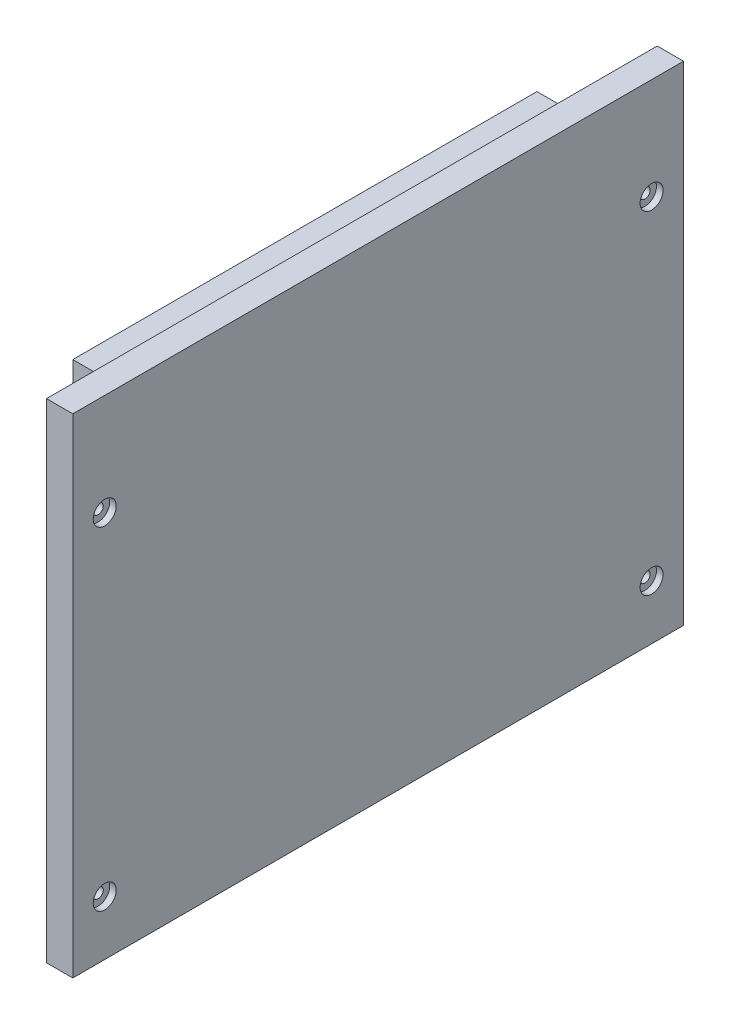
ISO-10303-21;
HEADER;
FILE_DESCRIPTION(('STEP AP214'),'2;1');
FILE_NAME('part.step','',(''),(''),'','','');
FILE_SCHEMA(('AUTOMOTIVE_DESIGN { 1 0 10303 214 1 1 1 1 }'));
ENDSEC;
DATA;
#1=APPLICATION_CONTEXT('core data for automotive mechanical design processes');
#2=APPLICATION_PROTOCOL_DEFINITION('international standard','automotive_design',2000,#1);
#3=PRODUCT_CONTEXT('',#1,'mechanical');
#4=PRODUCT('Part','Part','',(#3));
#5=PRODUCT_RELATED_PRODUCT_CATEGORY('part','',(#4));
#6=PRODUCT_DEFINITION_FORMATION('','',#4);
#7=PRODUCT_DEFINITION_CONTEXT('part definition',#1,'design');
#8=PRODUCT_DEFINITION('design','',#6,#7);
#9=PRODUCT_DEFINITION_SHAPE('','',#8);
#10=(LENGTH_UNIT() NAMED_UNIT(*) SI_UNIT(.MILLI.,.METRE.));
#11=(NAMED_UNIT(*) PLANE_ANGLE_UNIT() SI_UNIT($,.RADIAN.));
#12=(NAMED_UNIT(*) SI_UNIT($,.STERADIAN.) SOLID_ANGLE_UNIT());
#13=UNCERTAINTY_MEASURE_WITH_UNIT(LENGTH_MEASURE(1.E-05),#10,'distance_accuracy_value','');
#14=(GEOMETRIC_REPRESENTATION_CONTEXT(3) GLOBAL_UNCERTAINTY_ASSIGNED_CONTEXT((#13)) GLOBAL_UNIT_ASSIGNED_CONTEXT((#10,
#11,#12)) REPRESENTATION_CONTEXT('',''));
#15=CARTESIAN_POINT('',(0.,0.,0.));
#16=DIRECTION('',(0.,0.,1.));
#17=DIRECTION('',(1.,0.,0.));
#18=AXIS2_PLACEMENT_3D('',#15,#16,#17);
#19=CARTESIAN_POINT('',(39.,130.,175.));
#20=DIRECTION('',(0.,0.,-1.));
#21=DIRECTION('',(-1.,0.,0.));
#22=AXIS2_PLACEMENT_3D('',#19,#20,#21);
#23=PLANE('',#22);
#24=DIRECTION('',(0.,-1.,0.));
#25=VECTOR('',#24,1.);
#26=CARTESIAN_POINT('',(25.,130.,175.));
#27=LINE('',#26,#25);
#28=CARTESIAN_POINT('',(25.,130.,175.));
#29=VERTEX_POINT('',#28);
#30=CARTESIAN_POINT('',(25.,-130.,175.));
#31=VERTEX_POINT('',#30);
#32=EDGE_CURVE('E140',#29,#31,#27,.T.);
#33=ORIENTED_EDGE('',*,*,#32,.T.);
#34=DIRECTION('',(-1.,0.,0.));
#35=VECTOR('',#34,1.);
#36=CARTESIAN_POINT('',(39.,-130.,175.));
#37=LINE('',#36,#35);
#38=CARTESIAN_POINT('',(39.,-130.,175.));
#39=VERTEX_POINT('',#38);
#40=EDGE_CURVE('E40',#39,#31,#37,.T.);
#41=ORIENTED_EDGE('',*,*,#40,.F.);
#42=DIRECTION('',(0.,-1.,0.));
#43=VECTOR('',#42,1.);
#44=CARTESIAN_POINT('',(39.,130.,175.));
#45=LINE('',#44,#43);
#46=CARTESIAN_POINT('',(39.,130.,175.));
#47=VERTEX_POINT('',#46);
#48=EDGE_CURVE('E188',#47,#39,#45,.T.);
#49=ORIENTED_EDGE('',*,*,#48,.F.);
#50=DIRECTION('',(-1.,0.,0.));
#51=VECTOR('',#50,1.);
#52=CARTESIAN_POINT('',(39.,130.,175.));
#53=LINE('',#52,#51);
#54=EDGE_CURVE('E195',#47,#29,#53,.T.);
#55=ORIENTED_EDGE('',*,*,#54,.T.);
#56=EDGE_LOOP('',(#33,#41,#49,#55));
#57=FACE_BOUND('',#56,.T.);
#58=ADVANCED_FACE('F33',(#57),#23,.F.);
#59=CARTESIAN_POINT('',(39.,-130.,175.));
#60=DIRECTION('',(0.,1.,0.));
#61=DIRECTION('',(0.,0.,1.));
#62=AXIS2_PLACEMENT_3D('',#59,#60,#61);
#63=PLANE('',#62);
#64=ORIENTED_EDGE('',*,*,#40,.T.);
#65=DIRECTION('',(0.,0.,-1.));
#66=VECTOR('',#65,1.);
#67=CARTESIAN_POINT('',(25.,-130.,-150.));
#68=LINE('',#67,#66);
#69=CARTESIAN_POINT('',(25.,-130.,-150.));
#70=VERTEX_POINT('',#69);
#71=EDGE_CURVE('E128',#31,#70,#68,.T.);
#72=ORIENTED_EDGE('',*,*,#71,.T.);
#73=DIRECTION('',(-1.,0.,0.));
#74=VECTOR('',#73,1.);
#75=CARTESIAN_POINT('',(39.,-130.,-150.));
#76=LINE('',#75,#74);
#77=CARTESIAN_POINT('',(39.,-130.,-150.));
#78=VERTEX_POINT('',#77);
#79=EDGE_CURVE('E201',#78,#70,#76,.T.);
#80=ORIENTED_EDGE('',*,*,#79,.F.);
#81=DIRECTION('',(0.,0.,-1.));
#82=VECTOR('',#81,1.);
#83=CARTESIAN_POINT('',(39.,-130.,175.));
#84=LINE('',#83,#82);
#85=EDGE_CURVE('E190',#39,#78,#84,.T.);
#86=ORIENTED_EDGE('',*,*,#85,.F.);
#87=EDGE_LOOP('',(#64,#72,#80,#86));
#88=FACE_BOUND('',#87,.T.);
#89=ADVANCED_FACE('F231',(#88),#63,.F.);
#90=CARTESIAN_POINT('',(39.,130.,-150.));
#91=DIRECTION('',(0.,0.,1.));
#92=DIRECTION('',(1.,0.,0.));
#93=AXIS2_PLACEMENT_3D('',#90,#91,#92);
#94=PLANE('',#93);
#95=DIRECTION('',(0.,1.,0.));
#96=VECTOR('',#95,1.);
#97=CARTESIAN_POINT('',(25.,130.,-150.));
#98=LINE('',#97,#96);
#99=CARTESIAN_POINT('',(25.,130.,-150.));
#100=VERTEX_POINT('',#99);
#101=EDGE_CURVE('E134',#70,#100,#98,.T.);
#102=ORIENTED_EDGE('',*,*,#101,.T.);
#103=DIRECTION('',(-1.,0.,0.));
#104=VECTOR('',#103,1.);
#105=CARTESIAN_POINT('',(39.,130.,-150.));
#106=LINE('',#105,#104);
#107=CARTESIAN_POINT('',(39.,130.,-150.));
#108=VERTEX_POINT('',#107);
#109=EDGE_CURVE('E198',#108,#100,#106,.T.);
#110=ORIENTED_EDGE('',*,*,#109,.F.);
#111=DIRECTION('',(0.,1.,0.));
#112=VECTOR('',#111,1.);
#113=CARTESIAN_POINT('',(39.,130.,-150.));
#114=LINE('',#113,#112);
#115=EDGE_CURVE('E192',#78,#108,#114,.T.);
#116=ORIENTED_EDGE('',*,*,#115,.F.);
#117=ORIENTED_EDGE('',*,*,#79,.T.);
#118=EDGE_LOOP('',(#102,#110,#116,#117));
#119=FACE_BOUND('',#118,.T.);
#120=ADVANCED_FACE('F236',(#119),#94,.F.);
#121=CARTESIAN_POINT('',(39.,130.,175.));
#122=DIRECTION('',(0.,-1.,0.));
#123=DIRECTION('',(0.,0.,-1.));
#124=AXIS2_PLACEMENT_3D('',#121,#122,#123);
#125=PLANE('',#124);
#126=DIRECTION('',(0.,0.,1.));
#127=VECTOR('',#126,1.);
#128=CARTESIAN_POINT('',(25.,130.,-150.));
#129=LINE('',#128,#127);
#130=EDGE_CURVE('E129',#100,#29,#129,.T.);
#131=ORIENTED_EDGE('',*,*,#130,.T.);
#132=ORIENTED_EDGE('',*,*,#54,.F.);
#133=DIRECTION('',(0.,0.,1.));
#134=VECTOR('',#133,1.);
#135=CARTESIAN_POINT('',(39.,130.,175.));
#136=LINE('',#135,#134);
#137=EDGE_CURVE('E55',#108,#47,#136,.T.);
#138=ORIENTED_EDGE('',*,*,#137,.F.);
#139=ORIENTED_EDGE('',*,*,#109,.T.);
#140=EDGE_LOOP('',(#131,#132,#138,#139));
#141=FACE_BOUND('',#140,.T.);
#142=ADVANCED_FACE('F265',(#141),#125,.F.);
#143=CARTESIAN_POINT('',(0.,0.,0.));
#144=DIRECTION('',(1.,0.,0.));
#145=DIRECTION('',(0.,0.,-1.));
#146=AXIS2_PLACEMENT_3D('',#143,#144,#145);
#147=PLANE('',#146);
#148=DIRECTION('',(0.,-1.,0.));
#149=VECTOR('',#148,1.);
#150=CARTESIAN_POINT('',(0.,130.,-111.));
#151=LINE('',#150,#149);
#152=CARTESIAN_POINT('',(0.,116.,-111.));
#153=VERTEX_POINT('',#152);
#154=CARTESIAN_POINT('',(0.,-116.,-111.));
#155=VERTEX_POINT('',#154);
#156=EDGE_CURVE('E138',#153,#155,#151,.T.);
#157=ORIENTED_EDGE('',*,*,#156,.T.);
#158=DIRECTION('',(0.,0.,1.));
#159=VECTOR('',#158,1.);
#160=CARTESIAN_POINT('',(0.,-116.,-150.));
#161=LINE('',#160,#159);
#162=CARTESIAN_POINT('',(0.,-116.,136.));
#163=VERTEX_POINT('',#162);
#164=EDGE_CURVE('E109',#155,#163,#161,.T.);
#165=ORIENTED_EDGE('',*,*,#164,.T.);
#166=DIRECTION('',(0.,1.,0.));
#167=VECTOR('',#166,1.);
#168=CARTESIAN_POINT('',(0.,130.,136.));
#169=LINE('',#168,#167);
#170=CARTESIAN_POINT('',(0.,116.,136.));
#171=VERTEX_POINT('',#170);
#172=EDGE_CURVE('E47',#163,#171,#169,.T.);
#173=ORIENTED_EDGE('',*,*,#172,.T.);
#174=DIRECTION('',(0.,0.,1.));
#175=VECTOR('',#174,1.);
#176=CARTESIAN_POINT('',(0.,116.,-111.));
#177=LINE('',#176,#175);
#178=EDGE_CURVE('E277',#153,#171,#177,.T.);
#179=ORIENTED_EDGE('',*,*,#178,.F.);
#180=EDGE_LOOP('',(#157,#165,#173,#179));
#181=FACE_BOUND('',#180,.T.);
#182=ADVANCED_FACE('F225',(#181),#147,.F.);
#183=CARTESIAN_POINT('',(39.,-101.,157.999999999999));
#184=DIRECTION('',(1.,0.,0.));
#185=DIRECTION('',(0.,0.,-1.));
#186=AXIS2_PLACEMENT_3D('',#183,#184,#185);
#187=CYLINDRICAL_SURFACE('',#186,2.74999999999999);
#188=CARTESIAN_POINT('',(35.5,-101.,157.999999999999));
#189=DIRECTION('',(1.,0.,0.));
#190=DIRECTION('',(0.,0.,-1.));
#191=AXIS2_PLACEMENT_3D('',#188,#189,#190);
#192=CIRCLE('',#191,2.74999999999999);
#193=CARTESIAN_POINT('',(35.5,-101.,155.249999999999));
#194=VERTEX_POINT('',#193);
#195=EDGE_CURVE('E185',#194,#194,#192,.T.);
#196=ORIENTED_EDGE('',*,*,#195,.T.);
#197=EDGE_LOOP('',(#196));
#198=FACE_BOUND('',#197,.T.);
#199=CARTESIAN_POINT('',(25.,-101.,157.999999999999));
#200=DIRECTION('',(-1.,0.,0.));
#201=DIRECTION('',(0.,0.,1.));
#202=AXIS2_PLACEMENT_3D('',#199,#200,#201);
#203=CIRCLE('',#202,2.74999999999999);
#204=CARTESIAN_POINT('',(25.,-101.,160.749999999999));
#205=VERTEX_POINT('',#204);
#206=EDGE_CURVE('E149',#205,#205,#203,.F.);
#207=ORIENTED_EDGE('',*,*,#206,.F.);
#208=EDGE_LOOP('',(#207));
#209=FACE_BOUND('',#208,.T.);
#210=ADVANCED_FACE('F215',(#198,#209),#187,.F.);
#211=CARTESIAN_POINT('',(39.,76.,157.999999999999));
#212=DIRECTION('',(1.,0.,0.));
#213=DIRECTION('',(0.,0.,-1.));
#214=AXIS2_PLACEMENT_3D('',#211,#212,#213);
#215=CYLINDRICAL_SURFACE('',#214,2.74999999999999);
#216=CARTESIAN_POINT('',(35.5,76.,157.999999999999));
#217=DIRECTION('',(1.,0.,0.));
#218=DIRECTION('',(0.,0.,-1.));
#219=AXIS2_PLACEMENT_3D('',#216,#217,#218);
#220=CIRCLE('',#219,2.74999999999999);
#221=CARTESIAN_POINT('',(35.5,76.,155.249999999999));
#222=VERTEX_POINT('',#221);
#223=EDGE_CURVE('E176',#222,#222,#220,.T.);
#224=ORIENTED_EDGE('',*,*,#223,.T.);
#225=EDGE_LOOP('',(#224));
#226=FACE_BOUND('',#225,.T.);
#227=CARTESIAN_POINT('',(25.,76.,157.999999999999));
#228=DIRECTION('',(-1.,0.,0.));
#229=DIRECTION('',(0.,0.,1.));
#230=AXIS2_PLACEMENT_3D('',#227,#228,#229);
#231=CIRCLE('',#230,2.74999999999999);
#232=CARTESIAN_POINT('',(25.,76.,160.749999999999));
#233=VERTEX_POINT('',#232);
#234=EDGE_CURVE('E148',#233,#233,#231,.F.);
#235=ORIENTED_EDGE('',*,*,#234,.F.);
#236=EDGE_LOOP('',(#235));
#237=FACE_BOUND('',#236,.T.);
#238=ADVANCED_FACE('F212',(#226,#237),#215,.F.);
#239=CARTESIAN_POINT('',(39.,76.,-133.));
#240=DIRECTION('',(1.,0.,0.));
#241=DIRECTION('',(0.,0.,-1.));
#242=AXIS2_PLACEMENT_3D('',#239,#240,#241);
#243=CYLINDRICAL_SURFACE('',#242,2.74999999999999);
#244=CARTESIAN_POINT('',(35.5,76.,-133.));
#245=DIRECTION('',(1.,0.,0.));
#246=DIRECTION('',(0.,0.,-1.));
#247=AXIS2_PLACEMENT_3D('',#244,#245,#246);
#248=CIRCLE('',#247,2.74999999999999);
#249=CARTESIAN_POINT('',(35.5,76.,-135.75));
#250=VERTEX_POINT('',#249);
#251=EDGE_CURVE('E167',#250,#250,#248,.T.);
#252=ORIENTED_EDGE('',*,*,#251,.T.);
#253=EDGE_LOOP('',(#252));
#254=FACE_BOUND('',#253,.T.);
#255=CARTESIAN_POINT('',(25.,76.,-133.));
#256=DIRECTION('',(-1.,0.,0.));
#257=DIRECTION('',(0.,0.,1.));
#258=AXIS2_PLACEMENT_3D('',#255,#256,#257);
#259=CIRCLE('',#258,2.74999999999999);
#260=CARTESIAN_POINT('',(25.,76.,-130.25));
#261=VERTEX_POINT('',#260);
#262=EDGE_CURVE('E145',#261,#261,#259,.F.);
#263=ORIENTED_EDGE('',*,*,#262,.F.);
#264=EDGE_LOOP('',(#263));
#265=FACE_BOUND('',#264,.T.);
#266=ADVANCED_FACE('F214',(#254,#265),#243,.F.);
#267=CARTESIAN_POINT('',(39.,-101.,-133.));
#268=DIRECTION('',(1.,0.,0.));
#269=DIRECTION('',(0.,0.,-1.));
#270=AXIS2_PLACEMENT_3D('',#267,#268,#269);
#271=CYLINDRICAL_SURFACE('',#270,2.75);
#272=CARTESIAN_POINT('',(35.5,-101.,-133.));
#273=DIRECTION('',(1.,0.,0.));
#274=DIRECTION('',(0.,0.,-1.));
#275=AXIS2_PLACEMENT_3D('',#272,#273,#274);
#276=CIRCLE('',#275,2.75);
#277=CARTESIAN_POINT('',(35.5,-101.,-135.75));
#278=VERTEX_POINT('',#277);
#279=EDGE_CURVE('E158',#278,#278,#276,.T.);
#280=ORIENTED_EDGE('',*,*,#279,.T.);
#281=EDGE_LOOP('',(#280));
#282=FACE_BOUND('',#281,.T.);
#283=CARTESIAN_POINT('',(25.,-101.,-133.));
#284=DIRECTION('',(-1.,0.,0.));
#285=DIRECTION('',(0.,0.,1.));
#286=AXIS2_PLACEMENT_3D('',#283,#284,#285);
#287=CIRCLE('',#286,2.75);
#288=CARTESIAN_POINT('',(25.,-101.,-130.25));
#289=VERTEX_POINT('',#288);
#290=EDGE_CURVE('E132',#289,#289,#287,.F.);
#291=ORIENTED_EDGE('',*,*,#290,.F.);
#292=EDGE_LOOP('',(#291));
#293=FACE_BOUND('',#292,.T.);
#294=ADVANCED_FACE('F222',(#282,#293),#271,.F.);
#295=CARTESIAN_POINT('',(39.,0.,0.));
#296=DIRECTION('',(1.,0.,0.));
#297=DIRECTION('',(0.,0.,-1.));
#298=AXIS2_PLACEMENT_3D('',#295,#296,#297);
#299=PLANE('',#298);
#300=CARTESIAN_POINT('',(39.,-101.,-133.));
#301=DIRECTION('',(1.,0.,0.));
#302=DIRECTION('',(0.,0.,-1.));
#303=AXIS2_PLACEMENT_3D('',#300,#301,#302);
#304=CIRCLE('',#303,6.119);
#305=CARTESIAN_POINT('',(39.,-101.,-139.119));
#306=VERTEX_POINT('',#305);
#307=EDGE_CURVE('E152',#306,#306,#304,.T.);
#308=ORIENTED_EDGE('',*,*,#307,.F.);
#309=EDGE_LOOP('',(#308));
#310=FACE_BOUND('',#309,.T.);
#311=CARTESIAN_POINT('',(39.,76.,-133.));
#312=DIRECTION('',(1.,0.,0.));
#313=DIRECTION('',(0.,0.,-1.));
#314=AXIS2_PLACEMENT_3D('',#311,#312,#313);
#315=CIRCLE('',#314,6.119);
#316=CARTESIAN_POINT('',(39.,76.,-139.119));
#317=VERTEX_POINT('',#316);
#318=EDGE_CURVE('E161',#317,#317,#315,.T.);
#319=ORIENTED_EDGE('',*,*,#318,.F.);
#320=EDGE_LOOP('',(#319));
#321=FACE_BOUND('',#320,.T.);
#322=CARTESIAN_POINT('',(39.,76.,157.999999999999));
#323=DIRECTION('',(1.,0.,0.));
#324=DIRECTION('',(0.,0.,-1.));
#325=AXIS2_PLACEMENT_3D('',#322,#323,#324);
#326=CIRCLE('',#325,6.119);
#327=CARTESIAN_POINT('',(39.,76.,151.880999999999));
#328=VERTEX_POINT('',#327);
#329=EDGE_CURVE('E170',#328,#328,#326,.T.);
#330=ORIENTED_EDGE('',*,*,#329,.F.);
#331=EDGE_LOOP('',(#330));
#332=FACE_BOUND('',#331,.T.);
#333=CARTESIAN_POINT('',(39.,-101.,157.999999999999));
#334=DIRECTION('',(1.,0.,0.));
#335=DIRECTION('',(0.,0.,-1.));
#336=AXIS2_PLACEMENT_3D('',#333,#334,#335);
#337=CIRCLE('',#336,6.119);
#338=CARTESIAN_POINT('',(39.,-101.,151.880999999999));
#339=VERTEX_POINT('',#338);
#340=EDGE_CURVE('E179',#339,#339,#337,.T.);
#341=ORIENTED_EDGE('',*,*,#340,.F.);
#342=EDGE_LOOP('',(#341));
#343=FACE_BOUND('',#342,.T.);
#344=ORIENTED_EDGE('',*,*,#48,.T.);
#345=ORIENTED_EDGE('',*,*,#85,.T.);
#346=ORIENTED_EDGE('',*,*,#115,.T.);
#347=ORIENTED_EDGE('',*,*,#137,.T.);
#348=EDGE_LOOP('',(#344,#345,#346,#347));
#349=FACE_BOUND('',#348,.T.);
#350=ADVANCED_FACE('F246',(#310,#321,#332,#343,#349),#299,.T.);
#351=CARTESIAN_POINT('',(35.5,-98.25,157.999999999999));
#352=DIRECTION('',(-1.,0.,0.));
#353=DIRECTION('',(0.,0.,1.));
#354=AXIS2_PLACEMENT_3D('',#351,#352,#353);
#355=PLANE('',#354);
#356=ORIENTED_EDGE('',*,*,#195,.F.);
#357=EDGE_LOOP('',(#356));
#358=FACE_BOUND('',#357,.T.);
#359=CARTESIAN_POINT('',(35.5,-101.,157.999999999999));
#360=DIRECTION('',(1.,0.,0.));
#361=DIRECTION('',(0.,0.,-1.));
#362=AXIS2_PLACEMENT_3D('',#359,#360,#361);
#363=CIRCLE('',#362,6.119);
#364=CARTESIAN_POINT('',(35.5,-101.,151.880999999999));
#365=VERTEX_POINT('',#364);
#366=EDGE_CURVE('E182',#365,#365,#363,.T.);
#367=ORIENTED_EDGE('',*,*,#366,.T.);
#368=EDGE_LOOP('',(#367));
#369=FACE_BOUND('',#368,.T.);
#370=ADVANCED_FACE('F248',(#358,#369),#355,.F.);
#371=CARTESIAN_POINT('',(39.,-101.,157.999999999999));
#372=DIRECTION('',(1.,0.,0.));
#373=DIRECTION('',(0.,0.,-1.));
#374=AXIS2_PLACEMENT_3D('',#371,#372,#373);
#375=CYLINDRICAL_SURFACE('',#374,6.119);
#376=ORIENTED_EDGE('',*,*,#366,.F.);
#377=EDGE_LOOP('',(#376));
#378=FACE_BOUND('',#377,.T.);
#379=ORIENTED_EDGE('',*,*,#340,.T.);
#380=EDGE_LOOP('',(#379));
#381=FACE_BOUND('',#380,.T.);
#382=ADVANCED_FACE('F255',(#378,#381),#375,.F.);
#383=CARTESIAN_POINT('',(35.5,78.75,157.999999999999));
#384=DIRECTION('',(-1.,0.,0.));
#385=DIRECTION('',(0.,0.,1.));
#386=AXIS2_PLACEMENT_3D('',#383,#384,#385);
#387=PLANE('',#386);
#388=ORIENTED_EDGE('',*,*,#223,.F.);
#389=EDGE_LOOP('',(#388));
#390=FACE_BOUND('',#389,.T.);
#391=CARTESIAN_POINT('',(35.5,76.,157.999999999999));
#392=DIRECTION('',(1.,0.,0.));
#393=DIRECTION('',(0.,0.,-1.));
#394=AXIS2_PLACEMENT_3D('',#391,#392,#393);
#395=CIRCLE('',#394,6.119);
#396=CARTESIAN_POINT('',(35.5,76.,151.880999999999));
#397=VERTEX_POINT('',#396);
#398=EDGE_CURVE('E173',#397,#397,#395,.T.);
#399=ORIENTED_EDGE('',*,*,#398,.T.);
#400=EDGE_LOOP('',(#399));
#401=FACE_BOUND('',#400,.T.);
#402=ADVANCED_FACE('F336',(#390,#401),#387,.F.);
#403=CARTESIAN_POINT('',(39.,76.,157.999999999999));
#404=DIRECTION('',(1.,0.,0.));
#405=DIRECTION('',(0.,0.,-1.));
#406=AXIS2_PLACEMENT_3D('',#403,#404,#405);
#407=CYLINDRICAL_SURFACE('',#406,6.119);
#408=ORIENTED_EDGE('',*,*,#398,.F.);
#409=EDGE_LOOP('',(#408));
#410=FACE_BOUND('',#409,.T.);
#411=ORIENTED_EDGE('',*,*,#329,.T.);
#412=EDGE_LOOP('',(#411));
#413=FACE_BOUND('',#412,.T.);
#414=ADVANCED_FACE('F332',(#410,#413),#407,.F.);
#415=CARTESIAN_POINT('',(35.5,78.75,-133.));
#416=DIRECTION('',(-1.,0.,0.));
#417=DIRECTION('',(0.,0.,1.));
#418=AXIS2_PLACEMENT_3D('',#415,#416,#417);
#419=PLANE('',#418);
#420=ORIENTED_EDGE('',*,*,#251,.F.);
#421=EDGE_LOOP('',(#420));
#422=FACE_BOUND('',#421,.T.);
#423=CARTESIAN_POINT('',(35.5,76.,-133.));
#424=DIRECTION('',(1.,0.,0.));
#425=DIRECTION('',(0.,0.,-1.));
#426=AXIS2_PLACEMENT_3D('',#423,#424,#425);
#427=CIRCLE('',#426,6.119);
#428=CARTESIAN_POINT('',(35.5,76.,-139.119));
#429=VERTEX_POINT('',#428);
#430=EDGE_CURVE('E164',#429,#429,#427,.T.);
#431=ORIENTED_EDGE('',*,*,#430,.T.);
#432=EDGE_LOOP('',(#431));
#433=FACE_BOUND('',#432,.T.);
#434=ADVANCED_FACE('F329',(#422,#433),#419,.F.);
#435=CARTESIAN_POINT('',(39.,76.,-133.));
#436=DIRECTION('',(1.,0.,0.));
#437=DIRECTION('',(0.,0.,-1.));
#438=AXIS2_PLACEMENT_3D('',#435,#436,#437);
#439=CYLINDRICAL_SURFACE('',#438,6.119);
#440=ORIENTED_EDGE('',*,*,#430,.F.);
#441=EDGE_LOOP('',(#440));
#442=FACE_BOUND('',#441,.T.);
#443=ORIENTED_EDGE('',*,*,#318,.T.);
#444=EDGE_LOOP('',(#443));
#445=FACE_BOUND('',#444,.T.);
#446=ADVANCED_FACE('F324',(#442,#445),#439,.F.);
#447=CARTESIAN_POINT('',(35.5,-98.25,-133.));
#448=DIRECTION('',(-1.,0.,0.));
#449=DIRECTION('',(0.,0.,1.));
#450=AXIS2_PLACEMENT_3D('',#447,#448,#449);
#451=PLANE('',#450);
#452=ORIENTED_EDGE('',*,*,#279,.F.);
#453=EDGE_LOOP('',(#452));
#454=FACE_BOUND('',#453,.T.);
#455=CARTESIAN_POINT('',(35.5,-101.,-133.));
#456=DIRECTION('',(1.,0.,0.));
#457=DIRECTION('',(0.,0.,-1.));
#458=AXIS2_PLACEMENT_3D('',#455,#456,#457);
#459=CIRCLE('',#458,6.119);
#460=CARTESIAN_POINT('',(35.5,-101.,-139.119));
#461=VERTEX_POINT('',#460);
#462=EDGE_CURVE('E155',#461,#461,#459,.T.);
#463=ORIENTED_EDGE('',*,*,#462,.T.);
#464=EDGE_LOOP('',(#463));
#465=FACE_BOUND('',#464,.T.);
#466=ADVANCED_FACE('F321',(#454,#465),#451,.F.);
#467=CARTESIAN_POINT('',(39.,-101.,-133.));
#468=DIRECTION('',(1.,0.,0.));
#469=DIRECTION('',(0.,0.,-1.));
#470=AXIS2_PLACEMENT_3D('',#467,#468,#469);
#471=CYLINDRICAL_SURFACE('',#470,6.119);
#472=ORIENTED_EDGE('',*,*,#462,.F.);
#473=EDGE_LOOP('',(#472));
#474=FACE_BOUND('',#473,.T.);
#475=ORIENTED_EDGE('',*,*,#307,.T.);
#476=EDGE_LOOP('',(#475));
#477=FACE_BOUND('',#476,.T.);
#478=ADVANCED_FACE('F316',(#474,#477),#471,.F.);
#479=CARTESIAN_POINT('',(25.,0.,0.));
#480=DIRECTION('',(-1.,0.,0.));
#481=DIRECTION('',(0.,0.,1.));
#482=AXIS2_PLACEMENT_3D('',#479,#480,#481);
#483=PLANE('',#482);
#484=DIRECTION('',(0.,1.,0.));
#485=VECTOR('',#484,1.);
#486=CARTESIAN_POINT('',(25.,130.,136.));
#487=LINE('',#486,#485);
#488=CARTESIAN_POINT('',(25.,-116.,136.));
#489=VERTEX_POINT('',#488);
#490=CARTESIAN_POINT('',(25.,116.,136.));
#491=VERTEX_POINT('',#490);
#492=EDGE_CURVE('E123',#489,#491,#487,.T.);
#493=ORIENTED_EDGE('',*,*,#492,.F.);
#494=DIRECTION('',(0.,0.,1.));
#495=VECTOR('',#494,1.);
#496=CARTESIAN_POINT('',(25.,-116.,-150.));
#497=LINE('',#496,#495);
#498=CARTESIAN_POINT('',(25.,-116.,-111.));
#499=VERTEX_POINT('',#498);
#500=EDGE_CURVE('E107',#499,#489,#497,.T.);
#501=ORIENTED_EDGE('',*,*,#500,.F.);
#502=DIRECTION('',(0.,-1.,0.));
#503=VECTOR('',#502,1.);
#504=CARTESIAN_POINT('',(25.,130.,-111.));
#505=LINE('',#504,#503);
#506=CARTESIAN_POINT('',(25.,116.,-111.));
#507=VERTEX_POINT('',#506);
#508=EDGE_CURVE('E122',#507,#499,#505,.T.);
#509=ORIENTED_EDGE('',*,*,#508,.F.);
#510=DIRECTION('',(0.,0.,-1.));
#511=VECTOR('',#510,1.);
#512=CARTESIAN_POINT('',(25.,116.,-111.));
#513=LINE('',#512,#511);
#514=EDGE_CURVE('E280',#491,#507,#513,.T.);
#515=ORIENTED_EDGE('',*,*,#514,.F.);
#516=EDGE_LOOP('',(#493,#501,#509,#515));
#517=FACE_BOUND('',#516,.T.);
#518=ORIENTED_EDGE('',*,*,#71,.F.);
#519=ORIENTED_EDGE('',*,*,#32,.F.);
#520=ORIENTED_EDGE('',*,*,#130,.F.);
#521=ORIENTED_EDGE('',*,*,#101,.F.);
#522=EDGE_LOOP('',(#518,#519,#520,#521));
#523=FACE_BOUND('',#522,.T.);
#524=ORIENTED_EDGE('',*,*,#290,.T.);
#525=EDGE_LOOP('',(#524));
#526=FACE_BOUND('',#525,.T.);
#527=ORIENTED_EDGE('',*,*,#262,.T.);
#528=EDGE_LOOP('',(#527));
#529=FACE_BOUND('',#528,.T.);
#530=ORIENTED_EDGE('',*,*,#234,.T.);
#531=EDGE_LOOP('',(#530));
#532=FACE_BOUND('',#531,.T.);
#533=ORIENTED_EDGE('',*,*,#206,.T.);
#534=EDGE_LOOP('',(#533));
#535=FACE_BOUND('',#534,.T.);
#536=ADVANCED_FACE('F119',(#517,#523,#526,#529,#532,#535),#483,.T.);
#537=CARTESIAN_POINT('',(25.,130.,-111.));
#538=DIRECTION('',(0.,0.,-1.));
#539=DIRECTION('',(0.,1.,0.));
#540=AXIS2_PLACEMENT_3D('',#537,#538,#539);
#541=PLANE('',#540);
#542=DIRECTION('',(1.,0.,0.));
#543=VECTOR('',#542,1.);
#544=CARTESIAN_POINT('',(25.,-116.,-111.));
#545=LINE('',#544,#543);
#546=EDGE_CURVE('E104',#155,#499,#545,.T.);
#547=ORIENTED_EDGE('',*,*,#546,.F.);
#548=ORIENTED_EDGE('',*,*,#156,.F.);
#549=DIRECTION('',(-1.,0.,0.));
#550=VECTOR('',#549,1.);
#551=CARTESIAN_POINT('',(25.,116.,-111.));
#552=LINE('',#551,#550);
#553=EDGE_CURVE('E127',#507,#153,#552,.T.);
#554=ORIENTED_EDGE('',*,*,#553,.F.);
#555=ORIENTED_EDGE('',*,*,#508,.T.);
#556=EDGE_LOOP('',(#547,#548,#554,#555));
#557=FACE_BOUND('',#556,.T.);
#558=ADVANCED_FACE('F126',(#557),#541,.T.);
#559=CARTESIAN_POINT('',(25.,130.,136.));
#560=DIRECTION('',(0.,0.,1.));
#561=DIRECTION('',(0.,-1.,0.));
#562=AXIS2_PLACEMENT_3D('',#559,#560,#561);
#563=PLANE('',#562);
#564=DIRECTION('',(-1.,0.,0.));
#565=VECTOR('',#564,1.);
#566=CARTESIAN_POINT('',(25.,-116.,136.));
#567=LINE('',#566,#565);
#568=EDGE_CURVE('E11',#489,#163,#567,.T.);
#569=ORIENTED_EDGE('',*,*,#568,.F.);
#570=ORIENTED_EDGE('',*,*,#492,.T.);
#571=DIRECTION('',(1.,0.,0.));
#572=VECTOR('',#571,1.);
#573=CARTESIAN_POINT('',(25.,116.,136.));
#574=LINE('',#573,#572);
#575=EDGE_CURVE('E144',#171,#491,#574,.T.);
#576=ORIENTED_EDGE('',*,*,#575,.F.);
#577=ORIENTED_EDGE('',*,*,#172,.F.);
#578=EDGE_LOOP('',(#569,#570,#576,#577));
#579=FACE_BOUND('',#578,.T.);
#580=ADVANCED_FACE('F295',(#579),#563,.T.);
#581=CARTESIAN_POINT('',(0.,116.,0.));
#582=DIRECTION('',(0.,-1.,0.));
#583=DIRECTION('',(0.,0.,-1.));
#584=AXIS2_PLACEMENT_3D('',#581,#582,#583);
#585=PLANE('',#584);
#586=CARTESIAN_POINT('',(14.,116.,-71.5));
#587=DIRECTION('',(0.,1.,0.));
#588=DIRECTION('',(0.,0.,1.));
#589=AXIS2_PLACEMENT_3D('',#586,#587,#588);
#590=CIRCLE('',#589,2.99999999999999);
#591=CARTESIAN_POINT('',(14.,116.,-68.5));
#592=VERTEX_POINT('',#591);
#593=EDGE_CURVE('E114',#592,#592,#590,.T.);
#594=ORIENTED_EDGE('',*,*,#593,.F.);
#595=EDGE_LOOP('',(#594));
#596=FACE_BOUND('',#595,.T.);
#597=CARTESIAN_POINT('',(14.,116.,96.5));
#598=DIRECTION('',(0.,1.,0.));
#599=DIRECTION('',(0.,0.,1.));
#600=AXIS2_PLACEMENT_3D('',#597,#598,#599);
#601=CIRCLE('',#600,2.99999999999999);
#602=CARTESIAN_POINT('',(14.,116.,99.5));
#603=VERTEX_POINT('',#602);
#604=EDGE_CURVE('E285',#603,#603,#601,.T.);
#605=ORIENTED_EDGE('',*,*,#604,.F.);
#606=EDGE_LOOP('',(#605));
#607=FACE_BOUND('',#606,.T.);
#608=ORIENTED_EDGE('',*,*,#514,.T.);
#609=ORIENTED_EDGE('',*,*,#553,.T.);
#610=ORIENTED_EDGE('',*,*,#178,.T.);
#611=ORIENTED_EDGE('',*,*,#575,.T.);
#612=EDGE_LOOP('',(#608,#609,#610,#611));
#613=FACE_BOUND('',#612,.T.);
#614=ADVANCED_FACE('F297',(#596,#607,#613),#585,.F.);
#615=CARTESIAN_POINT('',(14.,101.,96.5));
#616=DIRECTION('',(0.,1.,0.));
#617=DIRECTION('',(0.,0.,1.));
#618=AXIS2_PLACEMENT_3D('',#615,#616,#617);
#619=CONICAL_SURFACE('',#618,2.99999999999999,1.02974425867665);
#620=CARTESIAN_POINT('',(14.,99.1974181429173,96.5));
#621=VERTEX_POINT('',#620);
#622=VERTEX_LOOP('',#621);
#623=FACE_BOUND('',#622,.T.);
#624=CARTESIAN_POINT('',(14.,101.,96.5));
#625=DIRECTION('',(0.,1.,0.));
#626=DIRECTION('',(0.,0.,1.));
#627=AXIS2_PLACEMENT_3D('',#624,#625,#626);
#628=CIRCLE('',#627,2.99999999999999);
#629=CARTESIAN_POINT('',(14.,101.,99.5));
#630=VERTEX_POINT('',#629);
#631=EDGE_CURVE('E282',#630,#630,#628,.T.);
#632=ORIENTED_EDGE('',*,*,#631,.T.);
#633=EDGE_LOOP('',(#632));
#634=FACE_BOUND('',#633,.T.);
#635=ADVANCED_FACE('F299',(#623,#634),#619,.F.);
#636=CARTESIAN_POINT('',(14.,116.,96.5));
#637=DIRECTION('',(0.,1.,0.));
#638=DIRECTION('',(0.,0.,1.));
#639=AXIS2_PLACEMENT_3D('',#636,#637,#638);
#640=CYLINDRICAL_SURFACE('',#639,2.99999999999999);
#641=ORIENTED_EDGE('',*,*,#631,.F.);
#642=EDGE_LOOP('',(#641));
#643=FACE_BOUND('',#642,.T.);
#644=ORIENTED_EDGE('',*,*,#604,.T.);
#645=EDGE_LOOP('',(#644));
#646=FACE_BOUND('',#645,.T.);
#647=ADVANCED_FACE('F306',(#643,#646),#640,.F.);
#648=CARTESIAN_POINT('',(14.,101.,-71.5));
#649=DIRECTION('',(0.,1.,0.));
#650=DIRECTION('',(0.,0.,1.));
#651=AXIS2_PLACEMENT_3D('',#648,#649,#650);
#652=CONICAL_SURFACE('',#651,2.99999999999999,1.02974425867665);
#653=CARTESIAN_POINT('',(14.,99.1974181429173,-71.5));
#654=VERTEX_POINT('',#653);
#655=VERTEX_LOOP('',#654);
#656=FACE_BOUND('',#655,.T.);
#657=CARTESIAN_POINT('',(14.,101.,-71.5));
#658=DIRECTION('',(0.,1.,0.));
#659=DIRECTION('',(0.,0.,1.));
#660=AXIS2_PLACEMENT_3D('',#657,#658,#659);
#661=CIRCLE('',#660,2.99999999999999);
#662=CARTESIAN_POINT('',(14.,101.,-68.5));
#663=VERTEX_POINT('',#662);
#664=EDGE_CURVE('E288',#663,#663,#661,.T.);
#665=ORIENTED_EDGE('',*,*,#664,.T.);
#666=EDGE_LOOP('',(#665));
#667=FACE_BOUND('',#666,.T.);
#668=ADVANCED_FACE('F475',(#656,#667),#652,.F.);
#669=CARTESIAN_POINT('',(14.,116.,-71.5));
#670=DIRECTION('',(0.,1.,0.));
#671=DIRECTION('',(0.,0.,1.));
#672=AXIS2_PLACEMENT_3D('',#669,#670,#671);
#673=CYLINDRICAL_SURFACE('',#672,2.99999999999999);
#674=ORIENTED_EDGE('',*,*,#664,.F.);
#675=EDGE_LOOP('',(#674));
#676=FACE_BOUND('',#675,.T.);
#677=ORIENTED_EDGE('',*,*,#593,.T.);
#678=EDGE_LOOP('',(#677));
#679=FACE_BOUND('',#678,.T.);
#680=ADVANCED_FACE('F466',(#676,#679),#673,.F.);
#681=CARTESIAN_POINT('',(0.,-116.,-150.));
#682=DIRECTION('',(0.,1.,0.));
#683=DIRECTION('',(0.,0.,1.));
#684=AXIS2_PLACEMENT_3D('',#681,#682,#683);
#685=PLANE('',#684);
#686=ORIENTED_EDGE('',*,*,#546,.T.);
#687=ORIENTED_EDGE('',*,*,#500,.T.);
#688=ORIENTED_EDGE('',*,*,#568,.T.);
#689=ORIENTED_EDGE('',*,*,#164,.F.);
#690=EDGE_LOOP('',(#686,#687,#688,#689));
#691=FACE_BOUND('',#690,.T.);
#692=ADVANCED_FACE('F106',(#691),#685,.F.);
#693=CLOSED_SHELL('',(#58,#89,#120,#142,#182,#210,#238,#266,#294,#350,#370,#382,#402,#414,#434,
#446,#466,#478,#536,#558,#580,#614,#635,#647,#668,#680,#692));
#694=MANIFOLD_SOLID_BREP('B2',#693);
#695=ADVANCED_BREP_SHAPE_REPRESENTATION('',(#18,#694),#14);
#696=SHAPE_DEFINITION_REPRESENTATION(#9,#695);
ENDSEC;
END-ISO-10303-21;
